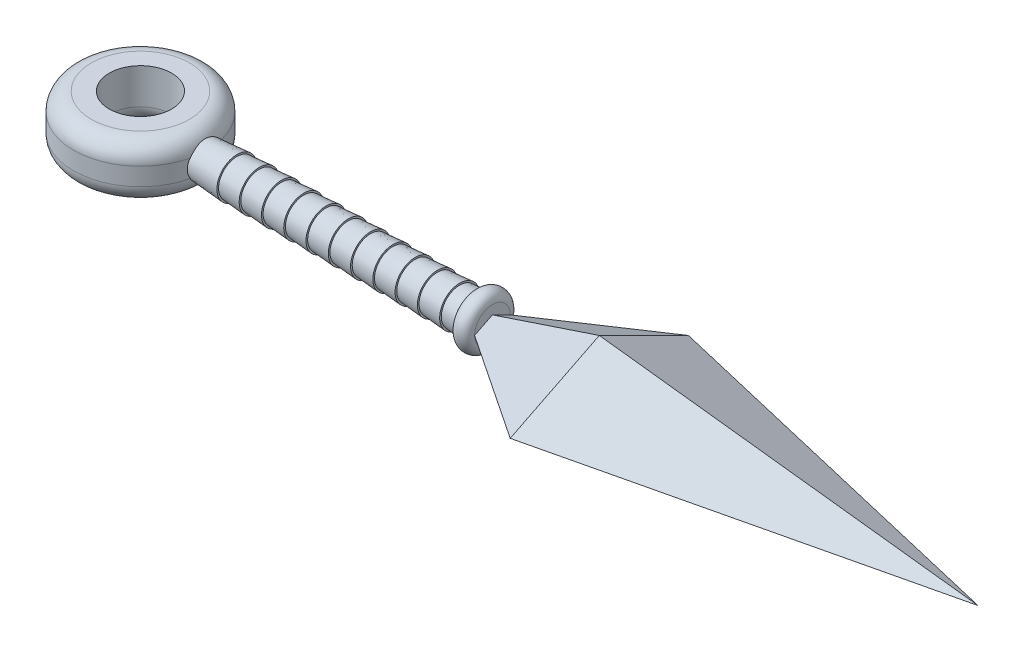
ISO-10303-21;
HEADER;
FILE_DESCRIPTION(('STEP AP214'),'2;1');
FILE_NAME('part.step','',(''),(''),'','','');
FILE_SCHEMA(('AUTOMOTIVE_DESIGN { 1 0 10303 214 1 1 1 1 }'));
ENDSEC;
DATA;
#1=APPLICATION_CONTEXT('core data for automotive mechanical design processes');
#2=APPLICATION_PROTOCOL_DEFINITION('international standard','automotive_design',2000,#1);
#3=PRODUCT_CONTEXT('',#1,'mechanical');
#4=PRODUCT('Part','Part','',(#3));
#5=PRODUCT_RELATED_PRODUCT_CATEGORY('part','',(#4));
#6=PRODUCT_DEFINITION_FORMATION('','',#4);
#7=PRODUCT_DEFINITION_CONTEXT('part definition',#1,'design');
#8=PRODUCT_DEFINITION('design','',#6,#7);
#9=PRODUCT_DEFINITION_SHAPE('','',#8);
#10=(LENGTH_UNIT() NAMED_UNIT(*) SI_UNIT(.MILLI.,.METRE.));
#11=(NAMED_UNIT(*) PLANE_ANGLE_UNIT() SI_UNIT($,.RADIAN.));
#12=(NAMED_UNIT(*) SI_UNIT($,.STERADIAN.) SOLID_ANGLE_UNIT());
#13=UNCERTAINTY_MEASURE_WITH_UNIT(LENGTH_MEASURE(1.E-05),#10,'distance_accuracy_value','');
#14=(GEOMETRIC_REPRESENTATION_CONTEXT(3) GLOBAL_UNCERTAINTY_ASSIGNED_CONTEXT((#13)) GLOBAL_UNIT_ASSIGNED_CONTEXT((#10,
#11,#12)) REPRESENTATION_CONTEXT('',''));
#15=CARTESIAN_POINT('',(0.,0.,0.));
#16=DIRECTION('',(0.,0.,1.));
#17=DIRECTION('',(1.,0.,0.));
#18=AXIS2_PLACEMENT_3D('',#15,#16,#17);
#19=CARTESIAN_POINT('',(79.,4.,0.));
#20=DIRECTION('',(-1.,0.,0.));
#21=DIRECTION('',(0.,0.,1.));
#22=AXIS2_PLACEMENT_3D('',#19,#20,#21);
#23=PLANE('',#22);
#24=DIRECTION('',(0.,-0.447213595499958,0.894427190999916));
#25=VECTOR('',#24,1.);
#26=CARTESIAN_POINT('',(79.,2.,0.));
#27=LINE('',#26,#25);
#28=CARTESIAN_POINT('',(79.,2.00000000000001,0.));
#29=VERTEX_POINT('',#28);
#30=CARTESIAN_POINT('',(79.,0.,4.));
#31=VERTEX_POINT('',#30);
#32=EDGE_CURVE('E117',#29,#31,#27,.T.);
#33=ORIENTED_EDGE('',*,*,#32,.F.);
#34=DIRECTION('',(0.,0.447213595499958,0.894427190999916));
#35=VECTOR('',#34,1.);
#36=CARTESIAN_POINT('',(79.,0.,-4.));
#37=LINE('',#36,#35);
#38=CARTESIAN_POINT('',(79.,0.,-4.));
#39=VERTEX_POINT('',#38);
#40=EDGE_CURVE('E119',#39,#29,#37,.T.);
#41=ORIENTED_EDGE('',*,*,#40,.F.);
#42=CARTESIAN_POINT('',(79.,0.,0.));
#43=DIRECTION('',(-1.,0.,0.));
#44=DIRECTION('',(0.,0.,1.));
#45=AXIS2_PLACEMENT_3D('',#42,#43,#44);
#46=CIRCLE('',#45,4.);
#47=EDGE_CURVE('E176',#31,#39,#46,.T.);
#48=ORIENTED_EDGE('',*,*,#47,.F.);
#49=EDGE_LOOP('',(#33,#41,#48));
#50=FACE_BOUND('',#49,.T.);
#51=ADVANCED_FACE('F53',(#50),#23,.F.);
#52=CARTESIAN_POINT('',(0.,6.,0.));
#53=DIRECTION('',(0.,-1.,0.));
#54=DIRECTION('',(0.,0.,-1.));
#55=AXIS2_PLACEMENT_3D('',#52,#53,#54);
#56=CYLINDRICAL_SURFACE('',#55,15.);
#57=CARTESIAN_POINT('',(14.6026895177223,2.0002,3.42949833780435));
#58=CARTESIAN_POINT('',(14.5898027183079,1.90425536880846,3.48434896734126));
#59=CARTESIAN_POINT('',(14.5775262472112,1.80596813467856,3.53525263515479));
#60=CARTESIAN_POINT('',(14.5545118084563,1.60537538612567,3.62884945497218));
#61=CARTESIAN_POINT('',(14.5437739831432,1.5030695010381,3.67154184744872));
#62=CARTESIAN_POINT('',(14.52416299699,1.29518599129669,3.74836648957147));
#63=CARTESIAN_POINT('',(14.5152887347409,1.18961034173205,3.78250379779121));
#64=CARTESIAN_POINT('',(14.4996571732844,0.975863662391319,3.84199054339593));
#65=CARTESIAN_POINT('',(14.492899753384,0.867692780962662,3.8673404818069));
#66=CARTESIAN_POINT('',(14.4816996505486,0.649407735327048,3.90907189044086));
#67=CARTESIAN_POINT('',(14.4772591749996,0.539291820918059,3.92544480887997));
#68=CARTESIAN_POINT('',(14.4708365407036,0.317972541135486,3.94905545692696));
#69=CARTESIAN_POINT('',(14.4688553123242,0.206768780239603,3.95628972927545));
#70=CARTESIAN_POINT('',(14.4674170263929,-0.0158450503848193,3.96154729459322));
#71=CARTESIAN_POINT('',(14.4679591923497,-0.127255046104362,3.95957342106495));
#72=CARTESIAN_POINT('',(14.4715442846459,-0.349503986640228,3.94644570968829));
#73=CARTESIAN_POINT('',(14.4745880450937,-0.46034272857715,3.93528880993468));
#74=CARTESIAN_POINT('',(14.4872394116135,-0.787720713955826,3.88858062635359));
#75=CARTESIAN_POINT('',(14.5003507782281,-1.00238367804788,3.83986137510824));
#76=CARTESIAN_POINT('',(14.5344938371439,-1.42002781856069,3.70850258711748));
#77=CARTESIAN_POINT('',(14.5555116640512,-1.62302873222404,3.62592240888374));
#78=CARTESIAN_POINT('',(14.583036524611,-1.84836498235012,3.51216427863207));
#79=CARTESIAN_POINT('',(14.5868813177834,-1.87905900410561,3.49616573837685));
#80=CARTESIAN_POINT('',(14.5946943912905,-1.93997484709813,3.46340602516859));
#81=CARTESIAN_POINT('',(14.5986625228771,-1.97019717578257,3.44664576038542));
#82=CARTESIAN_POINT('',(14.6026895177223,-2.0002,3.42949833780435));
#83=B_SPLINE_CURVE_WITH_KNOTS('',3,(#57,#58,#59,#60,#61,#62,#63,#64,#65,#66,#67,#68,#69,#70,#71,
#72,#73,#74,#75,#76,#77,#78,#79,#80,#81,#82),.UNSPECIFIED.,.F.,.F.,(4,2,2,2,2,2,2,2,2,2,2,2,4),
(0.,0.33370721789349,0.667445288239878,1.00098555303477,1.33450679736681,1.66834521463658,
2.00230988919674,2.33617180394934,2.67014508371666,3.32843128103565,3.98556839698756,
4.09004348792149,4.19439712802112),.UNSPECIFIED.);
#84=CARTESIAN_POINT('',(14.6026626720836,2.,3.42961264362858));
#85=VERTEX_POINT('',#84);
#86=CARTESIAN_POINT('',(14.6026626720836,-2.,3.42961264362858));
#87=VERTEX_POINT('',#86);
#88=EDGE_CURVE('E248',#85,#87,#83,.T.);
#89=ORIENTED_EDGE('',*,*,#88,.F.);
#90=CARTESIAN_POINT('',(0.,2.,0.));
#91=DIRECTION('',(0.,1.,0.));
#92=DIRECTION('',(0.,0.,1.));
#93=AXIS2_PLACEMENT_3D('',#90,#91,#92);
#94=CIRCLE('',#93,15.);
#95=CARTESIAN_POINT('',(14.6026626720819,2.,-3.42961264363576));
#96=VERTEX_POINT('',#95);
#97=EDGE_CURVE('E735',#85,#96,#94,.F.);
#98=ORIENTED_EDGE('',*,*,#97,.T.);
#99=CARTESIAN_POINT('',(14.6026895177223,-2.0002,-3.42949833780435));
#100=CARTESIAN_POINT('',(14.5898027183079,-1.90425536880846,-3.48434896734126));
#101=CARTESIAN_POINT('',(14.5775262472112,-1.80596813467856,-3.53525263515479));
#102=CARTESIAN_POINT('',(14.5545118084563,-1.60537538612567,-3.62884945497218));
#103=CARTESIAN_POINT('',(14.5437739831432,-1.5030695010381,-3.67154184744872));
#104=CARTESIAN_POINT('',(14.52416299699,-1.29518599129669,-3.74836648957147));
#105=CARTESIAN_POINT('',(14.5152887347409,-1.18961034173205,-3.78250379779121));
#106=CARTESIAN_POINT('',(14.4996571732844,-0.975863662391319,-3.84199054339593));
#107=CARTESIAN_POINT('',(14.492899753384,-0.867692780962662,-3.8673404818069));
#108=CARTESIAN_POINT('',(14.4816996505486,-0.649407735327048,-3.90907189044086));
#109=CARTESIAN_POINT('',(14.4772591749996,-0.539291820918059,-3.92544480887997));
#110=CARTESIAN_POINT('',(14.4708365407036,-0.317972541135486,-3.94905545692696));
#111=CARTESIAN_POINT('',(14.4688553123242,-0.206768780239603,-3.95628972927545));
#112=CARTESIAN_POINT('',(14.4674170263929,0.0158450503848193,-3.96154729459322));
#113=CARTESIAN_POINT('',(14.4679591923497,0.127255046104362,-3.95957342106495));
#114=CARTESIAN_POINT('',(14.4715442846459,0.349503986640228,-3.94644570968829));
#115=CARTESIAN_POINT('',(14.4745880450937,0.46034272857715,-3.93528880993468));
#116=CARTESIAN_POINT('',(14.4872394116135,0.787720713955826,-3.88858062635359));
#117=CARTESIAN_POINT('',(14.5003507782281,1.00238367804788,-3.83986137510824));
#118=CARTESIAN_POINT('',(14.5344938371439,1.42002781856069,-3.70850258711748));
#119=CARTESIAN_POINT('',(14.5555116640512,1.62302873222404,-3.62592240888374));
#120=CARTESIAN_POINT('',(14.583036524611,1.84836498235012,-3.51216427863207));
#121=CARTESIAN_POINT('',(14.5868813177834,1.87905900410561,-3.49616573837685));
#122=CARTESIAN_POINT('',(14.5946943912905,1.93997484709813,-3.46340602516859));
#123=CARTESIAN_POINT('',(14.5986625228771,1.97019717578257,-3.44664576038542));
#124=CARTESIAN_POINT('',(14.6026895177223,2.0002,-3.42949833780435));
#125=B_SPLINE_CURVE_WITH_KNOTS('',3,(#99,#100,#101,#102,#103,#104,#105,#106,#107,#108,#109,#110,
#111,#112,#113,#114,#115,#116,#117,#118,#119,#120,#121,#122,#123,#124),.UNSPECIFIED.,.F.,.F.,(4,
2,2,2,2,2,2,2,2,2,2,2,4),(0.,0.33370721789349,0.667445288239878,1.00098555303477,
1.33450679736681,1.66834521463658,2.00230988919674,2.33617180394934,2.67014508371666,
3.32843128103565,3.98556839698756,4.09004348792149,4.19439712802112),.UNSPECIFIED.);
#126=CARTESIAN_POINT('',(14.6026626720842,-2.00000000000431,-3.42961264362612));
#127=VERTEX_POINT('',#126);
#128=EDGE_CURVE('E76',#127,#96,#125,.T.);
#129=ORIENTED_EDGE('',*,*,#128,.F.);
#130=CARTESIAN_POINT('',(0.,-2.,0.));
#131=DIRECTION('',(0.,1.,0.));
#132=DIRECTION('',(0.,0.,1.));
#133=AXIS2_PLACEMENT_3D('',#130,#131,#132);
#134=CIRCLE('',#133,15.);
#135=EDGE_CURVE('E740',#127,#87,#134,.T.);
#136=ORIENTED_EDGE('',*,*,#135,.T.);
#137=EDGE_LOOP('',(#89,#98,#129,#136));
#138=FACE_BOUND('',#137,.T.);
#139=ADVANCED_FACE('F254',(#138),#56,.T.);
#140=CARTESIAN_POINT('',(0.,-2.,0.));
#141=DIRECTION('',(0.,1.,0.));
#142=DIRECTION('',(0.,0.,1.));
#143=AXIS2_PLACEMENT_3D('',#140,#141,#142);
#144=TOROIDAL_SURFACE('',#143,11.,4.);
#145=CARTESIAN_POINT('',(0.,-6.,0.));
#146=DIRECTION('',(0.,1.,0.));
#147=DIRECTION('',(0.,0.,1.));
#148=AXIS2_PLACEMENT_3D('',#145,#146,#147);
#149=CIRCLE('',#148,11.);
#150=CARTESIAN_POINT('',(0.,-6.,11.));
#151=VERTEX_POINT('',#150);
#152=EDGE_CURVE('E281',#151,#151,#149,.F.);
#153=ORIENTED_EDGE('',*,*,#152,.F.);
#154=EDGE_LOOP('',(#153));
#155=FACE_BOUND('',#154,.T.);
#156=ORIENTED_EDGE('',*,*,#135,.F.);
#157=CARTESIAN_POINT('',(14.6026358240473,-1.9998,-3.42972693377332));
#158=CARTESIAN_POINT('',(14.6144673175439,-2.08785496942259,-3.3794347538094));
#159=CARTESIAN_POINT('',(14.6238760330547,-2.17409094334977,-3.32545132173512));
#160=CARTESIAN_POINT('',(14.6383775795374,-2.34216456624991,-3.21062548840545));
#161=CARTESIAN_POINT('',(14.6434735339791,-2.42400535808358,-3.14978808730841));
#162=CARTESIAN_POINT('',(14.6498786115704,-2.58225725695865,-3.02202704161703));
#163=CARTESIAN_POINT('',(14.6512067333264,-2.65869370300854,-2.95513569314944));
#164=CARTESIAN_POINT('',(14.6507282612985,-2.80604321697924,-2.81555400588179));
#165=CARTESIAN_POINT('',(14.6489211841008,-2.87695543136173,-2.74286277445136));
#166=CARTESIAN_POINT('',(14.6397403622061,-3.08036781334348,-2.51724705340844));
#167=CARTESIAN_POINT('',(14.6286196250718,-3.20405544338849,-2.35636565716505));
#168=CARTESIAN_POINT('',(14.6015408876107,-3.42511179810113,-2.01773166708845));
#169=CARTESIAN_POINT('',(14.5855761681441,-3.52244360714607,-1.83995587561924));
#170=CARTESIAN_POINT('',(14.5527739382554,-3.69538905881278,-1.45735500811372));
#171=CARTESIAN_POINT('',(14.5359633810191,-3.76876484747941,-1.25150108425929));
#172=CARTESIAN_POINT('',(14.5152395500614,-3.85309591359787,-0.935811346660431));
#173=CARTESIAN_POINT('',(14.5090788865637,-3.87692138002166,-0.829390986464768));
#174=CARTESIAN_POINT('',(14.4987546132832,-3.9158825724834,-0.614885238202353));
#175=CARTESIAN_POINT('',(14.4945902694128,-3.93102149314649,-0.506800477283204));
#176=CARTESIAN_POINT('',(14.4885493783373,-3.95277036962221,-0.28703647264672));
#177=CARTESIAN_POINT('',(14.4867314429327,-3.95916205121098,-0.175334083790509));
#178=CARTESIAN_POINT('',(14.4857366298526,-3.96267438106053,0.048230460667895));
#179=CARTESIAN_POINT('',(14.4865598094357,-3.95979482832357,0.160092619681306));
#180=CARTESIAN_POINT('',(14.4907751944033,-3.94478192346463,0.38314235100532));
#181=CARTESIAN_POINT('',(14.4941672135074,-3.93264924233663,0.494329971641061));
#182=CARTESIAN_POINT('',(14.5032053784218,-3.89922263841361,0.715240922040292));
#183=CARTESIAN_POINT('',(14.50885236489,-3.87792529877927,0.824963689919859));
#184=CARTESIAN_POINT('',(14.5282281297023,-3.80137553516316,1.1469378656957));
#185=CARTESIAN_POINT('',(14.5445009327669,-3.73317966534952,1.3560969081464));
#186=CARTESIAN_POINT('',(14.578486754196,-3.56327932030152,1.76039585010761));
#187=CARTESIAN_POINT('',(14.5962007638941,-3.46155163091547,1.95552592300961));
#188=CARTESIAN_POINT('',(14.6190991330676,-3.28421708864113,2.23575697180788));
#189=CARTESIAN_POINT('',(14.6261808281916,-3.22006831601296,2.3281059354513));
#190=CARTESIAN_POINT('',(14.6381040484184,-3.08397900555625,2.50700258067255));
#191=CARTESIAN_POINT('',(14.6429466288061,-3.01204215798262,2.59355297860849));
#192=CARTESIAN_POINT('',(14.6495042925458,-2.8610026566783,2.75997262776878));
#193=CARTESIAN_POINT('',(14.6512255810089,-2.78191454914352,2.83985483288717));
#194=CARTESIAN_POINT('',(14.6507145361613,-2.61710474292006,2.99236652866701));
#195=CARTESIAN_POINT('',(14.6484846414504,-2.53138716704446,3.06500046360852));
#196=CARTESIAN_POINT('',(14.6402326772593,-2.37228895199523,3.18823302599143));
#197=CARTESIAN_POINT('',(14.6350836434285,-2.29999087995004,3.24029326536814));
#198=CARTESIAN_POINT('',(14.6214483992093,-2.15218898430208,3.3390785215082));
#199=CARTESIAN_POINT('',(14.6129637210817,-2.07668664679535,3.38580597524026));
#200=CARTESIAN_POINT('',(14.6026358240473,-1.9998,3.42972693377332));
#201=B_SPLINE_CURVE_WITH_KNOTS('',3,(#157,#158,#159,#160,#161,#162,#163,#164,#165,#166,#167,
#168,#169,#170,#171,#172,#173,#174,#175,#176,#177,#178,#179,#180,#181,#182,#183,#184,#185,#186,
#187,#188,#189,#190,#191,#192,#193,#194,#195,#196,#197,#198,#199,#200),.UNSPECIFIED.,.F.,.F.,(4,
2,2,2,2,2,2,2,2,2,2,2,2,2,2,2,2,2,2,2,2,4),(0.,0.306122148007137,0.612022400231305,
0.916377441152551,1.22077941449529,1.82763091102576,2.43532805616754,3.08962692079828,
3.41700866851222,3.74426993871478,4.07955713870031,4.4148516076663,4.75012176494301,
5.08551702869471,5.74412575172194,6.40319139201307,6.74082035140161,7.0782900251482,
7.41508807244956,7.75167832639429,8.0191296846116,8.28645832971511),.UNSPECIFIED.);
#202=EDGE_CURVE('E279',#127,#87,#201,.T.);
#203=ORIENTED_EDGE('',*,*,#202,.T.);
#204=EDGE_LOOP('',(#156,#203));
#205=FACE_BOUND('',#204,.T.);
#206=ADVANCED_FACE('F289',(#155,#205),#144,.T.);
#207=CARTESIAN_POINT('',(0.,2.,0.));
#208=DIRECTION('',(0.,1.,0.));
#209=DIRECTION('',(0.,0.,1.));
#210=AXIS2_PLACEMENT_3D('',#207,#208,#209);
#211=TOROIDAL_SURFACE('',#210,11.,4.);
#212=CARTESIAN_POINT('',(0.,6.,0.));
#213=DIRECTION('',(0.,1.,0.));
#214=DIRECTION('',(0.,0.,1.));
#215=AXIS2_PLACEMENT_3D('',#212,#213,#214);
#216=CIRCLE('',#215,11.);
#217=CARTESIAN_POINT('',(0.,6.,11.));
#218=VERTEX_POINT('',#217);
#219=EDGE_CURVE('E64',#218,#218,#216,.T.);
#220=ORIENTED_EDGE('',*,*,#219,.F.);
#221=EDGE_LOOP('',(#220));
#222=FACE_BOUND('',#221,.T.);
#223=ORIENTED_EDGE('',*,*,#97,.F.);
#224=CARTESIAN_POINT('',(14.6026358240473,1.9998,3.42972693377332));
#225=CARTESIAN_POINT('',(14.6144673175439,2.08785496942259,3.3794347538094));
#226=CARTESIAN_POINT('',(14.6238760330547,2.17409094334977,3.32545132173512));
#227=CARTESIAN_POINT('',(14.6383775795374,2.34216456624991,3.21062548840545));
#228=CARTESIAN_POINT('',(14.6434735339791,2.42400535808358,3.14978808730841));
#229=CARTESIAN_POINT('',(14.6498786115704,2.58225725695865,3.02202704161703));
#230=CARTESIAN_POINT('',(14.6512067333264,2.65869370300854,2.95513569314944));
#231=CARTESIAN_POINT('',(14.6507282612985,2.80604321697924,2.81555400588179));
#232=CARTESIAN_POINT('',(14.6489211841008,2.87695543136173,2.74286277445136));
#233=CARTESIAN_POINT('',(14.6397403622061,3.08036781334348,2.51724705340844));
#234=CARTESIAN_POINT('',(14.6286196250718,3.20405544338849,2.35636565716505));
#235=CARTESIAN_POINT('',(14.6015408876107,3.42511179810113,2.01773166708845));
#236=CARTESIAN_POINT('',(14.5855761681441,3.52244360714607,1.83995587561924));
#237=CARTESIAN_POINT('',(14.5527739382554,3.69538905881278,1.45735500811372));
#238=CARTESIAN_POINT('',(14.5359633810191,3.76876484747941,1.25150108425929));
#239=CARTESIAN_POINT('',(14.5152395500614,3.85309591359787,0.935811346660431));
#240=CARTESIAN_POINT('',(14.5090788865637,3.87692138002166,0.829390986464768));
#241=CARTESIAN_POINT('',(14.4987546132832,3.9158825724834,0.614885238202353));
#242=CARTESIAN_POINT('',(14.4945902694128,3.93102149314649,0.506800477283204));
#243=CARTESIAN_POINT('',(14.4885493783373,3.95277036962221,0.28703647264672));
#244=CARTESIAN_POINT('',(14.4867314429327,3.95916205121098,0.175334083790509));
#245=CARTESIAN_POINT('',(14.4857366298526,3.96267438106053,-0.048230460667895));
#246=CARTESIAN_POINT('',(14.4865598094357,3.95979482832357,-0.160092619681306));
#247=CARTESIAN_POINT('',(14.4907751944033,3.94478192346463,-0.38314235100532));
#248=CARTESIAN_POINT('',(14.4941672135074,3.93264924233663,-0.494329971641061));
#249=CARTESIAN_POINT('',(14.5032053784218,3.89922263841361,-0.715240922040292));
#250=CARTESIAN_POINT('',(14.50885236489,3.87792529877927,-0.824963689919859));
#251=CARTESIAN_POINT('',(14.5282281297023,3.80137553516316,-1.1469378656957));
#252=CARTESIAN_POINT('',(14.5445009327669,3.73317966534952,-1.3560969081464));
#253=CARTESIAN_POINT('',(14.578486754196,3.56327932030152,-1.76039585010761));
#254=CARTESIAN_POINT('',(14.5962007638941,3.46155163091547,-1.95552592300961));
#255=CARTESIAN_POINT('',(14.6190991330676,3.28421708864113,-2.23575697180788));
#256=CARTESIAN_POINT('',(14.6261808281916,3.22006831601296,-2.3281059354513));
#257=CARTESIAN_POINT('',(14.6381040484184,3.08397900555625,-2.50700258067255));
#258=CARTESIAN_POINT('',(14.6429466288061,3.01204215798262,-2.59355297860849));
#259=CARTESIAN_POINT('',(14.6495042925458,2.8610026566783,-2.75997262776878));
#260=CARTESIAN_POINT('',(14.6512255810089,2.78191454914352,-2.83985483288717));
#261=CARTESIAN_POINT('',(14.6507145361613,2.61710474292006,-2.99236652866701));
#262=CARTESIAN_POINT('',(14.6484846414504,2.53138716704446,-3.06500046360852));
#263=CARTESIAN_POINT('',(14.6402326772593,2.37228895199523,-3.18823302599143));
#264=CARTESIAN_POINT('',(14.6350836434285,2.29999087995004,-3.24029326536814));
#265=CARTESIAN_POINT('',(14.6214483992093,2.15218898430208,-3.3390785215082));
#266=CARTESIAN_POINT('',(14.6129637210817,2.07668664679535,-3.38580597524026));
#267=CARTESIAN_POINT('',(14.6026358240473,1.9998,-3.42972693377332));
#268=B_SPLINE_CURVE_WITH_KNOTS('',3,(#224,#225,#226,#227,#228,#229,#230,#231,#232,#233,#234,
#235,#236,#237,#238,#239,#240,#241,#242,#243,#244,#245,#246,#247,#248,#249,#250,#251,#252,#253,
#254,#255,#256,#257,#258,#259,#260,#261,#262,#263,#264,#265,#266,#267),.UNSPECIFIED.,.F.,.F.,(4,
2,2,2,2,2,2,2,2,2,2,2,2,2,2,2,2,2,2,2,2,4),(0.,0.306122148007137,0.612022400231305,
0.916377441152551,1.22077941449529,1.82763091102576,2.43532805616754,3.08962692079828,
3.41700866851222,3.74426993871478,4.07955713870031,4.4148516076663,4.75012176494301,
5.08551702869471,5.74412575172194,6.40319139201307,6.74082035140161,7.0782900251482,
7.41508807244956,7.75167832639429,8.0191296846116,8.28645832971511),.UNSPECIFIED.);
#269=EDGE_CURVE('E13',#85,#96,#268,.T.);
#270=ORIENTED_EDGE('',*,*,#269,.T.);
#271=EDGE_LOOP('',(#223,#270));
#272=FACE_BOUND('',#271,.T.);
#273=ADVANCED_FACE('F57',(#222,#272),#211,.T.);
#274=CARTESIAN_POINT('',(0.,6.,0.));
#275=DIRECTION('',(0.,1.,0.));
#276=DIRECTION('',(0.,0.,1.));
#277=AXIS2_PLACEMENT_3D('',#274,#275,#276);
#278=PLANE('',#277);
#279=ORIENTED_EDGE('',*,*,#219,.T.);
#280=EDGE_LOOP('',(#279));
#281=FACE_BOUND('',#280,.T.);
#282=CARTESIAN_POINT('',(0.,6.,0.));
#283=DIRECTION('',(0.,1.,0.));
#284=DIRECTION('',(0.,0.,1.));
#285=AXIS2_PLACEMENT_3D('',#282,#283,#284);
#286=CIRCLE('',#285,7.);
#287=CARTESIAN_POINT('',(0.,6.,7.));
#288=VERTEX_POINT('',#287);
#289=EDGE_CURVE('E286',#288,#288,#286,.T.);
#290=ORIENTED_EDGE('',*,*,#289,.F.);
#291=EDGE_LOOP('',(#290));
#292=FACE_BOUND('',#291,.T.);
#293=ADVANCED_FACE('F301',(#281,#292),#278,.T.);
#294=CARTESIAN_POINT('',(0.,6.,0.));
#295=DIRECTION('',(0.,-1.,0.));
#296=DIRECTION('',(0.,0.,-1.));
#297=AXIS2_PLACEMENT_3D('',#294,#295,#296);
#298=CYLINDRICAL_SURFACE('',#297,7.);
#299=CARTESIAN_POINT('',(0.,-2.,0.));
#300=DIRECTION('',(0.,1.,0.));
#301=DIRECTION('',(0.,0.,1.));
#302=AXIS2_PLACEMENT_3D('',#299,#300,#301);
#303=CIRCLE('',#302,7.);
#304=CARTESIAN_POINT('',(0.,-2.,7.));
#305=VERTEX_POINT('',#304);
#306=EDGE_CURVE('E730',#305,#305,#303,.F.);
#307=ORIENTED_EDGE('',*,*,#306,.T.);
#308=EDGE_LOOP('',(#307));
#309=FACE_BOUND('',#308,.T.);
#310=ORIENTED_EDGE('',*,*,#289,.T.);
#311=EDGE_LOOP('',(#310));
#312=FACE_BOUND('',#311,.T.);
#313=ADVANCED_FACE('F294',(#309,#312),#298,.F.);
#314=CARTESIAN_POINT('',(0.,-2.,0.));
#315=DIRECTION('',(0.,1.,0.));
#316=DIRECTION('',(0.,0.,1.));
#317=AXIS2_PLACEMENT_3D('',#314,#315,#316);
#318=TOROIDAL_SURFACE('',#317,11.,4.);
#319=ORIENTED_EDGE('',*,*,#306,.F.);
#320=EDGE_LOOP('',(#319));
#321=FACE_BOUND('',#320,.T.);
#322=ORIENTED_EDGE('',*,*,#152,.T.);
#323=EDGE_LOOP('',(#322));
#324=FACE_BOUND('',#323,.T.);
#325=ADVANCED_FACE('F295',(#321,#324),#318,.T.);
#326=CARTESIAN_POINT('',(21.6598337296243,0.,0.));
#327=DIRECTION('',(-1.,0.,0.));
#328=DIRECTION('',(0.,0.,1.));
#329=AXIS2_PLACEMENT_3D('',#326,#327,#328);
#330=PLANE('',#329);
#331=CARTESIAN_POINT('',(21.6598337296243,0.,0.));
#332=DIRECTION('',(-1.,0.,0.));
#333=DIRECTION('',(0.,0.,1.));
#334=AXIS2_PLACEMENT_3D('',#331,#332,#333);
#335=CIRCLE('',#334,4.12461525294851);
#336=CARTESIAN_POINT('',(21.6598337296243,0.,4.12461525294851));
#337=VERTEX_POINT('',#336);
#338=EDGE_CURVE('E239',#337,#337,#335,.F.);
#339=ORIENTED_EDGE('',*,*,#338,.F.);
#340=EDGE_LOOP('',(#339));
#341=FACE_BOUND('',#340,.T.);
#342=CARTESIAN_POINT('',(21.6598337296243,0.,0.));
#343=DIRECTION('',(-1.,0.,0.));
#344=DIRECTION('',(0.,0.,1.));
#345=AXIS2_PLACEMENT_3D('',#342,#343,#344);
#346=CIRCLE('',#345,4.5);
#347=CARTESIAN_POINT('',(21.6598337296243,0.,4.5));
#348=VERTEX_POINT('',#347);
#349=EDGE_CURVE('E237',#348,#348,#346,.T.);
#350=ORIENTED_EDGE('',*,*,#349,.F.);
#351=EDGE_LOOP('',(#350));
#352=FACE_BOUND('',#351,.T.);
#353=ADVANCED_FACE('F264',(#341,#352),#330,.F.);
#354=CARTESIAN_POINT('',(21.6598337296243,0.,0.));
#355=DIRECTION('',(1.,0.,0.));
#356=DIRECTION('',(0.,0.,-1.));
#357=AXIS2_PLACEMENT_3D('',#354,#355,#356);
#358=CONICAL_SURFACE('',#357,4.5,0.074936366262457);
#359=ORIENTED_EDGE('',*,*,#202,.F.);
#360=ORIENTED_EDGE('',*,*,#128,.T.);
#361=ORIENTED_EDGE('',*,*,#269,.F.);
#362=ORIENTED_EDGE('',*,*,#88,.T.);
#363=EDGE_LOOP('',(#359,#360,#361,#362));
#364=FACE_BOUND('',#363,.T.);
#365=ORIENTED_EDGE('',*,*,#349,.T.);
#366=EDGE_LOOP('',(#365));
#367=FACE_BOUND('',#366,.T.);
#368=ADVANCED_FACE('F259',(#364,#367),#358,.T.);
#369=CARTESIAN_POINT('',(26.6598337296243,0.,0.));
#370=DIRECTION('',(1.,0.,0.));
#371=DIRECTION('',(0.,0.,-1.));
#372=AXIS2_PLACEMENT_3D('',#369,#370,#371);
#373=CONICAL_SURFACE('',#372,4.5,0.074936366262457);
#374=CARTESIAN_POINT('',(26.6598337296243,0.,0.));
#375=DIRECTION('',(-1.,0.,0.));
#376=DIRECTION('',(0.,0.,1.));
#377=AXIS2_PLACEMENT_3D('',#374,#375,#376);
#378=CIRCLE('',#377,4.5);
#379=CARTESIAN_POINT('',(26.6598337296243,0.,4.5));
#380=VERTEX_POINT('',#379);
#381=EDGE_CURVE('E226',#380,#380,#378,.T.);
#382=ORIENTED_EDGE('',*,*,#381,.T.);
#383=EDGE_LOOP('',(#382));
#384=FACE_BOUND('',#383,.T.);
#385=ORIENTED_EDGE('',*,*,#338,.T.);
#386=EDGE_LOOP('',(#385));
#387=FACE_BOUND('',#386,.T.);
#388=ADVANCED_FACE('F262',(#384,#387),#373,.T.);
#389=CARTESIAN_POINT('',(26.6598337296243,0.,0.));
#390=DIRECTION('',(-1.,0.,0.));
#391=DIRECTION('',(0.,0.,1.));
#392=AXIS2_PLACEMENT_3D('',#389,#390,#391);
#393=PLANE('',#392);
#394=CARTESIAN_POINT('',(26.6598337296243,0.,0.));
#395=DIRECTION('',(-1.,0.,0.));
#396=DIRECTION('',(0.,0.,1.));
#397=AXIS2_PLACEMENT_3D('',#394,#395,#396);
#398=CIRCLE('',#397,4.12461525294851);
#399=CARTESIAN_POINT('',(26.6598337296243,0.,4.12461525294851));
#400=VERTEX_POINT('',#399);
#401=EDGE_CURVE('E234',#400,#400,#398,.F.);
#402=ORIENTED_EDGE('',*,*,#401,.F.);
#403=EDGE_LOOP('',(#402));
#404=FACE_BOUND('',#403,.T.);
#405=ORIENTED_EDGE('',*,*,#381,.F.);
#406=EDGE_LOOP('',(#405));
#407=FACE_BOUND('',#406,.T.);
#408=ADVANCED_FACE('F266',(#404,#407),#393,.F.);
#409=CARTESIAN_POINT('',(31.6598337296243,0.,0.));
#410=DIRECTION('',(1.,0.,0.));
#411=DIRECTION('',(0.,0.,-1.));
#412=AXIS2_PLACEMENT_3D('',#409,#410,#411);
#413=CONICAL_SURFACE('',#412,4.5,0.074936366262457);
#414=CARTESIAN_POINT('',(31.6598337296243,0.,0.));
#415=DIRECTION('',(-1.,0.,0.));
#416=DIRECTION('',(0.,0.,1.));
#417=AXIS2_PLACEMENT_3D('',#414,#415,#416);
#418=CIRCLE('',#417,4.5);
#419=CARTESIAN_POINT('',(31.6598337296243,0.,4.5));
#420=VERTEX_POINT('',#419);
#421=EDGE_CURVE('E221',#420,#420,#418,.T.);
#422=ORIENTED_EDGE('',*,*,#421,.T.);
#423=EDGE_LOOP('',(#422));
#424=FACE_BOUND('',#423,.T.);
#425=ORIENTED_EDGE('',*,*,#401,.T.);
#426=EDGE_LOOP('',(#425));
#427=FACE_BOUND('',#426,.T.);
#428=ADVANCED_FACE('F630',(#424,#427),#413,.T.);
#429=CARTESIAN_POINT('',(31.6598337296243,0.,0.));
#430=DIRECTION('',(-1.,0.,0.));
#431=DIRECTION('',(0.,0.,1.));
#432=AXIS2_PLACEMENT_3D('',#429,#430,#431);
#433=PLANE('',#432);
#434=CARTESIAN_POINT('',(31.6598337296243,0.,0.));
#435=DIRECTION('',(-1.,0.,0.));
#436=DIRECTION('',(0.,0.,1.));
#437=AXIS2_PLACEMENT_3D('',#434,#435,#436);
#438=CIRCLE('',#437,4.12461525294851);
#439=CARTESIAN_POINT('',(31.6598337296243,0.,4.12461525294851));
#440=VERTEX_POINT('',#439);
#441=EDGE_CURVE('E230',#440,#440,#438,.F.);
#442=ORIENTED_EDGE('',*,*,#441,.F.);
#443=EDGE_LOOP('',(#442));
#444=FACE_BOUND('',#443,.T.);
#445=ORIENTED_EDGE('',*,*,#421,.F.);
#446=EDGE_LOOP('',(#445));
#447=FACE_BOUND('',#446,.T.);
#448=ADVANCED_FACE('F617',(#444,#447),#433,.F.);
#449=CARTESIAN_POINT('',(36.6598337296243,0.,0.));
#450=DIRECTION('',(1.,0.,0.));
#451=DIRECTION('',(0.,0.,-1.));
#452=AXIS2_PLACEMENT_3D('',#449,#450,#451);
#453=CONICAL_SURFACE('',#452,4.5,0.074936366262457);
#454=CARTESIAN_POINT('',(36.6598337296243,0.,0.));
#455=DIRECTION('',(-1.,0.,0.));
#456=DIRECTION('',(0.,0.,1.));
#457=AXIS2_PLACEMENT_3D('',#454,#455,#456);
#458=CIRCLE('',#457,4.5);
#459=CARTESIAN_POINT('',(36.6598337296243,0.,4.5));
#460=VERTEX_POINT('',#459);
#461=EDGE_CURVE('E217',#460,#460,#458,.T.);
#462=ORIENTED_EDGE('',*,*,#461,.T.);
#463=EDGE_LOOP('',(#462));
#464=FACE_BOUND('',#463,.T.);
#465=ORIENTED_EDGE('',*,*,#441,.T.);
#466=EDGE_LOOP('',(#465));
#467=FACE_BOUND('',#466,.T.);
#468=ADVANCED_FACE('F607',(#464,#467),#453,.T.);
#469=CARTESIAN_POINT('',(36.6598337296243,0.,0.));
#470=DIRECTION('',(-1.,0.,0.));
#471=DIRECTION('',(0.,0.,1.));
#472=AXIS2_PLACEMENT_3D('',#469,#470,#471);
#473=PLANE('',#472);
#474=CARTESIAN_POINT('',(36.6598337296243,0.,0.));
#475=DIRECTION('',(-1.,0.,0.));
#476=DIRECTION('',(0.,0.,1.));
#477=AXIS2_PLACEMENT_3D('',#474,#475,#476);
#478=CIRCLE('',#477,4.12461525294851);
#479=CARTESIAN_POINT('',(36.6598337296243,0.,4.12461525294851));
#480=VERTEX_POINT('',#479);
#481=EDGE_CURVE('E222',#480,#480,#478,.F.);
#482=ORIENTED_EDGE('',*,*,#481,.F.);
#483=EDGE_LOOP('',(#482));
#484=FACE_BOUND('',#483,.T.);
#485=ORIENTED_EDGE('',*,*,#461,.F.);
#486=EDGE_LOOP('',(#485));
#487=FACE_BOUND('',#486,.T.);
#488=ADVANCED_FACE('F596',(#484,#487),#473,.F.);
#489=CARTESIAN_POINT('',(41.6598337296243,0.,0.));
#490=DIRECTION('',(1.,0.,0.));
#491=DIRECTION('',(0.,0.,-1.));
#492=AXIS2_PLACEMENT_3D('',#489,#490,#491);
#493=CONICAL_SURFACE('',#492,4.5,0.074936366262457);
#494=CARTESIAN_POINT('',(41.6598337296243,0.,0.));
#495=DIRECTION('',(-1.,0.,0.));
#496=DIRECTION('',(0.,0.,1.));
#497=AXIS2_PLACEMENT_3D('',#494,#495,#496);
#498=CIRCLE('',#497,4.5);
#499=CARTESIAN_POINT('',(41.6598337296243,0.,4.5));
#500=VERTEX_POINT('',#499);
#501=EDGE_CURVE('E215',#500,#500,#498,.T.);
#502=ORIENTED_EDGE('',*,*,#501,.T.);
#503=EDGE_LOOP('',(#502));
#504=FACE_BOUND('',#503,.T.);
#505=ORIENTED_EDGE('',*,*,#481,.T.);
#506=EDGE_LOOP('',(#505));
#507=FACE_BOUND('',#506,.T.);
#508=ADVANCED_FACE('F584',(#504,#507),#493,.T.);
#509=CARTESIAN_POINT('',(41.6598337296243,0.,0.));
#510=DIRECTION('',(-1.,0.,0.));
#511=DIRECTION('',(0.,0.,1.));
#512=AXIS2_PLACEMENT_3D('',#509,#510,#511);
#513=PLANE('',#512);
#514=CARTESIAN_POINT('',(41.6598337296243,0.,0.));
#515=DIRECTION('',(-1.,0.,0.));
#516=DIRECTION('',(0.,0.,1.));
#517=AXIS2_PLACEMENT_3D('',#514,#515,#516);
#518=CIRCLE('',#517,4.12461525294851);
#519=CARTESIAN_POINT('',(41.6598337296243,0.,4.12461525294851));
#520=VERTEX_POINT('',#519);
#521=EDGE_CURVE('E214',#520,#520,#518,.F.);
#522=ORIENTED_EDGE('',*,*,#521,.F.);
#523=EDGE_LOOP('',(#522));
#524=FACE_BOUND('',#523,.T.);
#525=ORIENTED_EDGE('',*,*,#501,.F.);
#526=EDGE_LOOP('',(#525));
#527=FACE_BOUND('',#526,.T.);
#528=ADVANCED_FACE('F571',(#524,#527),#513,.F.);
#529=CARTESIAN_POINT('',(46.6598337296243,0.,0.));
#530=DIRECTION('',(1.,0.,0.));
#531=DIRECTION('',(0.,0.,-1.));
#532=AXIS2_PLACEMENT_3D('',#529,#530,#531);
#533=CONICAL_SURFACE('',#532,4.5,0.074936366262457);
#534=CARTESIAN_POINT('',(46.6598337296243,0.,0.));
#535=DIRECTION('',(-1.,0.,0.));
#536=DIRECTION('',(0.,0.,1.));
#537=AXIS2_PLACEMENT_3D('',#534,#535,#536);
#538=CIRCLE('',#537,4.5);
#539=CARTESIAN_POINT('',(46.6598337296243,0.,4.5));
#540=VERTEX_POINT('',#539);
#541=EDGE_CURVE('E206',#540,#540,#538,.T.);
#542=ORIENTED_EDGE('',*,*,#541,.T.);
#543=EDGE_LOOP('',(#542));
#544=FACE_BOUND('',#543,.T.);
#545=ORIENTED_EDGE('',*,*,#521,.T.);
#546=EDGE_LOOP('',(#545));
#547=FACE_BOUND('',#546,.T.);
#548=ADVANCED_FACE('F563',(#544,#547),#533,.T.);
#549=CARTESIAN_POINT('',(46.6598337296243,0.,0.));
#550=DIRECTION('',(-1.,0.,0.));
#551=DIRECTION('',(0.,0.,1.));
#552=AXIS2_PLACEMENT_3D('',#549,#550,#551);
#553=PLANE('',#552);
#554=CARTESIAN_POINT('',(46.6598337296243,0.,0.));
#555=DIRECTION('',(-1.,0.,0.));
#556=DIRECTION('',(0.,0.,1.));
#557=AXIS2_PLACEMENT_3D('',#554,#555,#556);
#558=CIRCLE('',#557,4.12461525294851);
#559=CARTESIAN_POINT('',(46.6598337296243,0.,4.12461525294851));
#560=VERTEX_POINT('',#559);
#561=EDGE_CURVE('E207',#560,#560,#558,.F.);
#562=ORIENTED_EDGE('',*,*,#561,.F.);
#563=EDGE_LOOP('',(#562));
#564=FACE_BOUND('',#563,.T.);
#565=ORIENTED_EDGE('',*,*,#541,.F.);
#566=EDGE_LOOP('',(#565));
#567=FACE_BOUND('',#566,.T.);
#568=ADVANCED_FACE('F551',(#564,#567),#553,.F.);
#569=CARTESIAN_POINT('',(51.6598337296243,0.,0.));
#570=DIRECTION('',(1.,0.,0.));
#571=DIRECTION('',(0.,0.,-1.));
#572=AXIS2_PLACEMENT_3D('',#569,#570,#571);
#573=CONICAL_SURFACE('',#572,4.5,0.074936366262457);
#574=CARTESIAN_POINT('',(51.6598337296243,0.,0.));
#575=DIRECTION('',(-1.,0.,0.));
#576=DIRECTION('',(0.,0.,1.));
#577=AXIS2_PLACEMENT_3D('',#574,#575,#576);
#578=CIRCLE('',#577,4.5);
#579=CARTESIAN_POINT('',(51.6598337296243,0.,4.5));
#580=VERTEX_POINT('',#579);
#581=EDGE_CURVE('E199',#580,#580,#578,.T.);
#582=ORIENTED_EDGE('',*,*,#581,.T.);
#583=EDGE_LOOP('',(#582));
#584=FACE_BOUND('',#583,.T.);
#585=ORIENTED_EDGE('',*,*,#561,.T.);
#586=EDGE_LOOP('',(#585));
#587=FACE_BOUND('',#586,.T.);
#588=ADVANCED_FACE('F543',(#584,#587),#573,.T.);
#589=CARTESIAN_POINT('',(51.6598337296243,0.,0.));
#590=DIRECTION('',(-1.,0.,0.));
#591=DIRECTION('',(0.,0.,1.));
#592=AXIS2_PLACEMENT_3D('',#589,#590,#591);
#593=PLANE('',#592);
#594=CARTESIAN_POINT('',(51.6598337296243,0.,0.));
#595=DIRECTION('',(-1.,0.,0.));
#596=DIRECTION('',(0.,0.,1.));
#597=AXIS2_PLACEMENT_3D('',#594,#595,#596);
#598=CIRCLE('',#597,4.12461525294851);
#599=CARTESIAN_POINT('',(51.6598337296243,0.,4.12461525294851));
#600=VERTEX_POINT('',#599);
#601=EDGE_CURVE('E201',#600,#600,#598,.F.);
#602=ORIENTED_EDGE('',*,*,#601,.F.);
#603=EDGE_LOOP('',(#602));
#604=FACE_BOUND('',#603,.T.);
#605=ORIENTED_EDGE('',*,*,#581,.F.);
#606=EDGE_LOOP('',(#605));
#607=FACE_BOUND('',#606,.T.);
#608=ADVANCED_FACE('F531',(#604,#607),#593,.F.);
#609=CARTESIAN_POINT('',(56.6598337296243,0.,0.));
#610=DIRECTION('',(1.,0.,0.));
#611=DIRECTION('',(0.,0.,-1.));
#612=AXIS2_PLACEMENT_3D('',#609,#610,#611);
#613=CONICAL_SURFACE('',#612,4.5,0.074936366262457);
#614=CARTESIAN_POINT('',(56.6598337296243,0.,0.));
#615=DIRECTION('',(-1.,0.,0.));
#616=DIRECTION('',(0.,0.,1.));
#617=AXIS2_PLACEMENT_3D('',#614,#615,#616);
#618=CIRCLE('',#617,4.5);
#619=CARTESIAN_POINT('',(56.6598337296243,0.,4.5));
#620=VERTEX_POINT('',#619);
#621=EDGE_CURVE('E193',#620,#620,#618,.T.);
#622=ORIENTED_EDGE('',*,*,#621,.T.);
#623=EDGE_LOOP('',(#622));
#624=FACE_BOUND('',#623,.T.);
#625=ORIENTED_EDGE('',*,*,#601,.T.);
#626=EDGE_LOOP('',(#625));
#627=FACE_BOUND('',#626,.T.);
#628=ADVANCED_FACE('F522',(#624,#627),#613,.T.);
#629=CARTESIAN_POINT('',(56.6598337296243,0.,0.));
#630=DIRECTION('',(-1.,0.,0.));
#631=DIRECTION('',(0.,0.,1.));
#632=AXIS2_PLACEMENT_3D('',#629,#630,#631);
#633=PLANE('',#632);
#634=CARTESIAN_POINT('',(56.6598337296243,0.,0.));
#635=DIRECTION('',(-1.,0.,0.));
#636=DIRECTION('',(0.,0.,1.));
#637=AXIS2_PLACEMENT_3D('',#634,#635,#636);
#638=CIRCLE('',#637,4.12461525294851);
#639=CARTESIAN_POINT('',(56.6598337296243,0.,4.12461525294851));
#640=VERTEX_POINT('',#639);
#641=EDGE_CURVE('E197',#640,#640,#638,.F.);
#642=ORIENTED_EDGE('',*,*,#641,.F.);
#643=EDGE_LOOP('',(#642));
#644=FACE_BOUND('',#643,.T.);
#645=ORIENTED_EDGE('',*,*,#621,.F.);
#646=EDGE_LOOP('',(#645));
#647=FACE_BOUND('',#646,.T.);
#648=ADVANCED_FACE('F515',(#644,#647),#633,.F.);
#649=CARTESIAN_POINT('',(61.6598337296243,0.,0.));
#650=DIRECTION('',(1.,0.,0.));
#651=DIRECTION('',(0.,0.,-1.));
#652=AXIS2_PLACEMENT_3D('',#649,#650,#651);
#653=CONICAL_SURFACE('',#652,4.5,0.074936366262457);
#654=CARTESIAN_POINT('',(61.6598337296243,0.,0.));
#655=DIRECTION('',(-1.,0.,0.));
#656=DIRECTION('',(0.,0.,1.));
#657=AXIS2_PLACEMENT_3D('',#654,#655,#656);
#658=CIRCLE('',#657,4.5);
#659=CARTESIAN_POINT('',(61.6598337296243,0.,4.5));
#660=VERTEX_POINT('',#659);
#661=EDGE_CURVE('E188',#660,#660,#658,.T.);
#662=ORIENTED_EDGE('',*,*,#661,.T.);
#663=EDGE_LOOP('',(#662));
#664=FACE_BOUND('',#663,.T.);
#665=ORIENTED_EDGE('',*,*,#641,.T.);
#666=EDGE_LOOP('',(#665));
#667=FACE_BOUND('',#666,.T.);
#668=ADVANCED_FACE('F502',(#664,#667),#653,.T.);
#669=CARTESIAN_POINT('',(61.6598337296243,0.,0.));
#670=DIRECTION('',(-1.,0.,0.));
#671=DIRECTION('',(0.,0.,1.));
#672=AXIS2_PLACEMENT_3D('',#669,#670,#671);
#673=PLANE('',#672);
#674=CARTESIAN_POINT('',(61.6598337296243,0.,0.));
#675=DIRECTION('',(-1.,0.,0.));
#676=DIRECTION('',(0.,0.,1.));
#677=AXIS2_PLACEMENT_3D('',#674,#675,#676);
#678=CIRCLE('',#677,4.12461525294851);
#679=CARTESIAN_POINT('',(61.6598337296243,0.,4.12461525294851));
#680=VERTEX_POINT('',#679);
#681=EDGE_CURVE('E191',#680,#680,#678,.F.);
#682=ORIENTED_EDGE('',*,*,#681,.F.);
#683=EDGE_LOOP('',(#682));
#684=FACE_BOUND('',#683,.T.);
#685=ORIENTED_EDGE('',*,*,#661,.F.);
#686=EDGE_LOOP('',(#685));
#687=FACE_BOUND('',#686,.T.);
#688=ADVANCED_FACE('F491',(#684,#687),#673,.F.);
#689=CARTESIAN_POINT('',(66.6598337296243,0.,0.));
#690=DIRECTION('',(1.,0.,0.));
#691=DIRECTION('',(0.,0.,-1.));
#692=AXIS2_PLACEMENT_3D('',#689,#690,#691);
#693=CONICAL_SURFACE('',#692,4.5,0.074936366262457);
#694=CARTESIAN_POINT('',(66.6598337296243,0.,0.));
#695=DIRECTION('',(-1.,0.,0.));
#696=DIRECTION('',(0.,0.,1.));
#697=AXIS2_PLACEMENT_3D('',#694,#695,#696);
#698=CIRCLE('',#697,4.5);
#699=CARTESIAN_POINT('',(66.6598337296243,0.,4.5));
#700=VERTEX_POINT('',#699);
#701=EDGE_CURVE('E185',#700,#700,#698,.T.);
#702=ORIENTED_EDGE('',*,*,#701,.T.);
#703=EDGE_LOOP('',(#702));
#704=FACE_BOUND('',#703,.T.);
#705=ORIENTED_EDGE('',*,*,#681,.T.);
#706=EDGE_LOOP('',(#705));
#707=FACE_BOUND('',#706,.T.);
#708=ADVANCED_FACE('F477',(#704,#707),#693,.T.);
#709=CARTESIAN_POINT('',(66.6598337296243,0.,0.));
#710=DIRECTION('',(-1.,0.,0.));
#711=DIRECTION('',(0.,0.,1.));
#712=AXIS2_PLACEMENT_3D('',#709,#710,#711);
#713=PLANE('',#712);
#714=CARTESIAN_POINT('',(66.6598337296243,0.,0.));
#715=DIRECTION('',(-1.,0.,0.));
#716=DIRECTION('',(0.,0.,1.));
#717=AXIS2_PLACEMENT_3D('',#714,#715,#716);
#718=CIRCLE('',#717,4.12461525294851);
#719=CARTESIAN_POINT('',(66.6598337296243,0.,4.12461525294851));
#720=VERTEX_POINT('',#719);
#721=EDGE_CURVE('E183',#720,#720,#718,.F.);
#722=ORIENTED_EDGE('',*,*,#721,.F.);
#723=EDGE_LOOP('',(#722));
#724=FACE_BOUND('',#723,.T.);
#725=ORIENTED_EDGE('',*,*,#701,.F.);
#726=EDGE_LOOP('',(#725));
#727=FACE_BOUND('',#726,.T.);
#728=ADVANCED_FACE('F470',(#724,#727),#713,.F.);
#729=CARTESIAN_POINT('',(71.6598337296243,0.,0.));
#730=DIRECTION('',(1.,0.,0.));
#731=DIRECTION('',(0.,0.,-1.));
#732=AXIS2_PLACEMENT_3D('',#729,#730,#731);
#733=CONICAL_SURFACE('',#732,4.5,0.074936366262457);
#734=CARTESIAN_POINT('',(71.6598337296243,0.,0.));
#735=DIRECTION('',(-1.,0.,0.));
#736=DIRECTION('',(0.,0.,1.));
#737=AXIS2_PLACEMENT_3D('',#734,#735,#736);
#738=CIRCLE('',#737,4.5);
#739=CARTESIAN_POINT('',(71.6598337296243,0.,4.5));
#740=VERTEX_POINT('',#739);
#741=EDGE_CURVE('E171',#740,#740,#738,.T.);
#742=ORIENTED_EDGE('',*,*,#741,.T.);
#743=EDGE_LOOP('',(#742));
#744=FACE_BOUND('',#743,.T.);
#745=ORIENTED_EDGE('',*,*,#721,.T.);
#746=EDGE_LOOP('',(#745));
#747=FACE_BOUND('',#746,.T.);
#748=ADVANCED_FACE('F459',(#744,#747),#733,.T.);
#749=CARTESIAN_POINT('',(71.6598337296243,0.,0.));
#750=DIRECTION('',(-1.,0.,0.));
#751=DIRECTION('',(0.,0.,1.));
#752=AXIS2_PLACEMENT_3D('',#749,#750,#751);
#753=PLANE('',#752);
#754=CARTESIAN_POINT('',(71.6598337296243,0.,0.));
#755=DIRECTION('',(-1.,0.,0.));
#756=DIRECTION('',(0.,0.,1.));
#757=AXIS2_PLACEMENT_3D('',#754,#755,#756);
#758=CIRCLE('',#757,4.12461525294851);
#759=CARTESIAN_POINT('',(71.6598337296243,0.,4.12461525294851));
#760=VERTEX_POINT('',#759);
#761=EDGE_CURVE('E178',#760,#760,#758,.F.);
#762=ORIENTED_EDGE('',*,*,#761,.F.);
#763=EDGE_LOOP('',(#762));
#764=FACE_BOUND('',#763,.T.);
#765=ORIENTED_EDGE('',*,*,#741,.F.);
#766=EDGE_LOOP('',(#765));
#767=FACE_BOUND('',#766,.T.);
#768=ADVANCED_FACE('F448',(#764,#767),#753,.F.);
#769=CARTESIAN_POINT('',(76.6598337296243,0.,0.));
#770=DIRECTION('',(1.,0.,0.));
#771=DIRECTION('',(0.,0.,-1.));
#772=AXIS2_PLACEMENT_3D('',#769,#770,#771);
#773=CONICAL_SURFACE('',#772,4.5,0.074936366262457);
#774=CARTESIAN_POINT('',(75.0360635908572,0.,0.));
#775=DIRECTION('',(1.,0.,0.));
#776=DIRECTION('',(0.,0.,-1.));
#777=AXIS2_PLACEMENT_3D('',#774,#775,#776);
#778=CIRCLE('',#777,4.37809229143783);
#779=CARTESIAN_POINT('',(75.0360635908572,0.,-4.37809229143783));
#780=VERTEX_POINT('',#779);
#781=EDGE_CURVE('E175',#780,#780,#778,.T.);
#782=ORIENTED_EDGE('',*,*,#781,.F.);
#783=EDGE_LOOP('',(#782));
#784=FACE_BOUND('',#783,.T.);
#785=ORIENTED_EDGE('',*,*,#761,.T.);
#786=EDGE_LOOP('',(#785));
#787=FACE_BOUND('',#786,.T.);
#788=ADVANCED_FACE('F324',(#784,#787),#773,.T.);
#789=CARTESIAN_POINT('',(77.,0.,0.));
#790=DIRECTION('',(-1.,0.,0.));
#791=DIRECTION('',(0.,0.,1.));
#792=AXIS2_PLACEMENT_3D('',#789,#790,#791);
#793=TOROIDAL_SURFACE('',#792,4.,2.);
#794=ORIENTED_EDGE('',*,*,#47,.T.);
#795=EDGE_CURVE('E329',#39,#31,#46,.T.);
#796=ORIENTED_EDGE('',*,*,#795,.T.);
#797=EDGE_LOOP('',(#794,#796));
#798=FACE_BOUND('',#797,.T.);
#799=ORIENTED_EDGE('',*,*,#781,.T.);
#800=EDGE_LOOP('',(#799));
#801=FACE_BOUND('',#800,.T.);
#802=ADVANCED_FACE('F317',(#798,#801),#793,.T.);
#803=ORIENTED_EDGE('',*,*,#795,.F.);
#804=DIRECTION('',(0.,0.447213595499958,-0.894427190999916));
#805=VECTOR('',#804,1.);
#806=CARTESIAN_POINT('',(79.,-2.,0.));
#807=LINE('',#806,#805);
#808=CARTESIAN_POINT('',(79.,-2.,0.));
#809=VERTEX_POINT('',#808);
#810=EDGE_CURVE('E335',#809,#39,#807,.T.);
#811=ORIENTED_EDGE('',*,*,#810,.F.);
#812=DIRECTION('',(0.,-0.447213595499958,-0.894427190999916));
#813=VECTOR('',#812,1.);
#814=CARTESIAN_POINT('',(79.,0.,4.));
#815=LINE('',#814,#813);
#816=EDGE_CURVE('E334',#31,#809,#815,.T.);
#817=ORIENTED_EDGE('',*,*,#816,.F.);
#818=EDGE_LOOP('',(#803,#811,#817));
#819=FACE_BOUND('',#818,.T.);
#820=ADVANCED_FACE('F306',(#819),#23,.F.);
#821=CARTESIAN_POINT('',(5.95918367346939,-17.8775510204082,8.93877551020409));
#822=DIRECTION('',(-0.285714285714286,0.857142857142857,-0.428571428571429));
#823=DIRECTION('',(0.,0.447213595499958,0.894427190999916));
#824=AXIS2_PLACEMENT_3D('',#821,#822,#823);
#825=PLANE('',#824);
#826=DIRECTION('',(-0.832050294337844,0.,0.554700196225229));
#827=VECTOR('',#826,1.);
#828=CARTESIAN_POINT('',(103.,0.,-20.));
#829=LINE('',#828,#827);
#830=CARTESIAN_POINT('',(103.,0.,-20.));
#831=VERTEX_POINT('',#830);
#832=EDGE_CURVE('E152',#831,#39,#829,.T.);
#833=ORIENTED_EDGE('',*,*,#832,.T.);
#834=ORIENTED_EDGE('',*,*,#40,.T.);
#835=DIRECTION('',(-0.948683298050514,-0.316227766016838,0.));
#836=VECTOR('',#835,1.);
#837=CARTESIAN_POINT('',(103.,10.,0.));
#838=LINE('',#837,#836);
#839=CARTESIAN_POINT('',(103.,10.,0.));
#840=VERTEX_POINT('',#839);
#841=EDGE_CURVE('E75',#840,#29,#838,.T.);
#842=ORIENTED_EDGE('',*,*,#841,.F.);
#843=DIRECTION('',(0.,0.447213595499958,0.894427190999916));
#844=VECTOR('',#843,1.);
#845=CARTESIAN_POINT('',(103.,10.,0.));
#846=LINE('',#845,#844);
#847=EDGE_CURVE('E142',#831,#840,#846,.T.);
#848=ORIENTED_EDGE('',*,*,#847,.F.);
#849=EDGE_LOOP('',(#833,#834,#842,#848));
#850=FACE_BOUND('',#849,.T.);
#851=ADVANCED_FACE('F318',(#850),#825,.T.);
#852=CARTESIAN_POINT('',(5.95918367346938,-17.8775510204082,-8.93877551020408));
#853=DIRECTION('',(-0.285714285714286,0.857142857142857,0.428571428571429));
#854=DIRECTION('',(0.,-0.447213595499958,0.894427190999916));
#855=AXIS2_PLACEMENT_3D('',#852,#853,#854);
#856=PLANE('',#855);
#857=ORIENTED_EDGE('',*,*,#841,.T.);
#858=ORIENTED_EDGE('',*,*,#32,.T.);
#859=DIRECTION('',(-0.832050294337844,0.,-0.554700196225229));
#860=VECTOR('',#859,1.);
#861=CARTESIAN_POINT('',(103.,0.,20.));
#862=LINE('',#861,#860);
#863=CARTESIAN_POINT('',(103.,0.,20.));
#864=VERTEX_POINT('',#863);
#865=EDGE_CURVE('E109',#864,#31,#862,.T.);
#866=ORIENTED_EDGE('',*,*,#865,.F.);
#867=DIRECTION('',(0.,-0.447213595499958,0.894427190999916));
#868=VECTOR('',#867,1.);
#869=CARTESIAN_POINT('',(103.,0.,20.));
#870=LINE('',#869,#868);
#871=EDGE_CURVE('E111',#840,#864,#870,.T.);
#872=ORIENTED_EDGE('',*,*,#871,.F.);
#873=EDGE_LOOP('',(#857,#858,#866,#872));
#874=FACE_BOUND('',#873,.T.);
#875=ADVANCED_FACE('F115',(#874),#856,.T.);
#876=CARTESIAN_POINT('',(5.95918367346938,17.8775510204082,8.93877551020408));
#877=DIRECTION('',(-0.285714285714286,-0.857142857142857,-0.428571428571429));
#878=DIRECTION('',(0.,0.447213595499958,-0.894427190999916));
#879=AXIS2_PLACEMENT_3D('',#876,#877,#878);
#880=PLANE('',#879);
#881=DIRECTION('',(-0.948683298050514,0.316227766016838,0.));
#882=VECTOR('',#881,1.);
#883=CARTESIAN_POINT('',(103.,-10.,0.));
#884=LINE('',#883,#882);
#885=CARTESIAN_POINT('',(103.,-10.,0.));
#886=VERTEX_POINT('',#885);
#887=EDGE_CURVE('E116',#886,#809,#884,.T.);
#888=ORIENTED_EDGE('',*,*,#887,.T.);
#889=ORIENTED_EDGE('',*,*,#810,.T.);
#890=ORIENTED_EDGE('',*,*,#832,.F.);
#891=DIRECTION('',(0.,0.447213595499958,-0.894427190999916));
#892=VECTOR('',#891,1.);
#893=CARTESIAN_POINT('',(103.,0.,-20.));
#894=LINE('',#893,#892);
#895=EDGE_CURVE('E144',#886,#831,#894,.T.);
#896=ORIENTED_EDGE('',*,*,#895,.F.);
#897=EDGE_LOOP('',(#888,#889,#890,#896));
#898=FACE_BOUND('',#897,.T.);
#899=ADVANCED_FACE('F368',(#898),#880,.T.);
#900=CARTESIAN_POINT('',(5.95918367346939,17.8775510204082,-8.93877551020408));
#901=DIRECTION('',(-0.285714285714286,-0.857142857142857,0.428571428571429));
#902=DIRECTION('',(0.,-0.447213595499958,-0.894427190999916));
#903=AXIS2_PLACEMENT_3D('',#900,#901,#902);
#904=PLANE('',#903);
#905=ORIENTED_EDGE('',*,*,#865,.T.);
#906=ORIENTED_EDGE('',*,*,#816,.T.);
#907=ORIENTED_EDGE('',*,*,#887,.F.);
#908=DIRECTION('',(0.,-0.447213595499958,-0.894427190999916));
#909=VECTOR('',#908,1.);
#910=CARTESIAN_POINT('',(103.,-10.,0.));
#911=LINE('',#910,#909);
#912=EDGE_CURVE('E124',#864,#886,#911,.T.);
#913=ORIENTED_EDGE('',*,*,#912,.F.);
#914=EDGE_LOOP('',(#905,#906,#907,#913));
#915=FACE_BOUND('',#914,.T.);
#916=ADVANCED_FACE('F125',(#915),#904,.T.);
#917=CARTESIAN_POINT('',(2.05886379192334,-17.5003422313484,-8.75017111567421));
#918=DIRECTION('',(-0.104648951970521,0.889516091749428,0.444758045874715));
#919=DIRECTION('',(0.,-0.447213595499958,0.894427190999916));
#920=AXIS2_PLACEMENT_3D('',#917,#918,#919);
#921=PLANE('',#920);
#922=DIRECTION('',(0.973417168333576,0.,0.229039333725547));
#923=VECTOR('',#922,1.);
#924=CARTESIAN_POINT('',(103.,0.,-20.));
#925=LINE('',#924,#923);
#926=CARTESIAN_POINT('',(188.,0.,0.));
#927=VERTEX_POINT('',#926);
#928=EDGE_CURVE('E351',#831,#927,#925,.T.);
#929=ORIENTED_EDGE('',*,*,#928,.T.);
#930=DIRECTION('',(0.993150604322876,0.116841247567397,0.));
#931=VECTOR('',#930,1.);
#932=CARTESIAN_POINT('',(103.,-10.,0.));
#933=LINE('',#932,#931);
#934=EDGE_CURVE('E134',#886,#927,#933,.T.);
#935=ORIENTED_EDGE('',*,*,#934,.F.);
#936=ORIENTED_EDGE('',*,*,#895,.T.);
#937=EDGE_LOOP('',(#929,#935,#936));
#938=FACE_BOUND('',#937,.T.);
#939=ADVANCED_FACE('F373',(#938),#921,.F.);
#940=CARTESIAN_POINT('',(2.05886379192334,-17.5003422313484,8.7501711156742));
#941=DIRECTION('',(-0.104648951970521,0.889516091749428,-0.444758045874714));
#942=DIRECTION('',(0.,0.447213595499958,0.894427190999916));
#943=AXIS2_PLACEMENT_3D('',#940,#941,#942);
#944=PLANE('',#943);
#945=ORIENTED_EDGE('',*,*,#934,.T.);
#946=DIRECTION('',(0.973417168333576,0.,-0.229039333725547));
#947=VECTOR('',#946,1.);
#948=CARTESIAN_POINT('',(103.,0.,20.));
#949=LINE('',#948,#947);
#950=EDGE_CURVE('E128',#864,#927,#949,.T.);
#951=ORIENTED_EDGE('',*,*,#950,.F.);
#952=ORIENTED_EDGE('',*,*,#912,.T.);
#953=EDGE_LOOP('',(#945,#951,#952));
#954=FACE_BOUND('',#953,.T.);
#955=ADVANCED_FACE('F133',(#954),#944,.F.);
#956=CARTESIAN_POINT('',(2.05886379192334,17.5003422313484,-8.7501711156742));
#957=DIRECTION('',(-0.104648951970521,-0.889516091749428,0.444758045874714));
#958=DIRECTION('',(0.,-0.447213595499958,-0.894427190999916));
#959=AXIS2_PLACEMENT_3D('',#956,#957,#958);
#960=PLANE('',#959);
#961=DIRECTION('',(0.993150604322876,-0.116841247567397,0.));
#962=VECTOR('',#961,1.);
#963=CARTESIAN_POINT('',(103.,10.,0.));
#964=LINE('',#963,#962);
#965=EDGE_CURVE('E139',#840,#927,#964,.T.);
#966=ORIENTED_EDGE('',*,*,#965,.T.);
#967=ORIENTED_EDGE('',*,*,#928,.F.);
#968=ORIENTED_EDGE('',*,*,#847,.T.);
#969=EDGE_LOOP('',(#966,#967,#968));
#970=FACE_BOUND('',#969,.T.);
#971=ADVANCED_FACE('F354',(#970),#960,.F.);
#972=CARTESIAN_POINT('',(2.05886379192334,17.5003422313484,8.7501711156742));
#973=DIRECTION('',(-0.104648951970521,-0.889516091749428,-0.444758045874714));
#974=DIRECTION('',(0.,0.447213595499958,-0.894427190999916));
#975=AXIS2_PLACEMENT_3D('',#972,#973,#974);
#976=PLANE('',#975);
#977=ORIENTED_EDGE('',*,*,#950,.T.);
#978=ORIENTED_EDGE('',*,*,#965,.F.);
#979=ORIENTED_EDGE('',*,*,#871,.T.);
#980=EDGE_LOOP('',(#977,#978,#979));
#981=FACE_BOUND('',#980,.T.);
#982=ADVANCED_FACE('F140',(#981),#976,.F.);
#983=CLOSED_SHELL('',(#51,#139,#206,#273,#293,#313,#325,#353,#368,#388,#408,#428,#448,#468,#488,
#508,#528,#548,#568,#588,#608,#628,#648,#668,#688,#708,#728,#748,#768,#788,#802,#820,#851,#875,
#899,#916,#939,#955,#971,#982));
#984=MANIFOLD_SOLID_BREP('B2',#983);
#985=ADVANCED_BREP_SHAPE_REPRESENTATION('',(#18,#984),#14);
#986=SHAPE_DEFINITION_REPRESENTATION(#9,#985);
ENDSEC;
END-ISO-10303-21;
